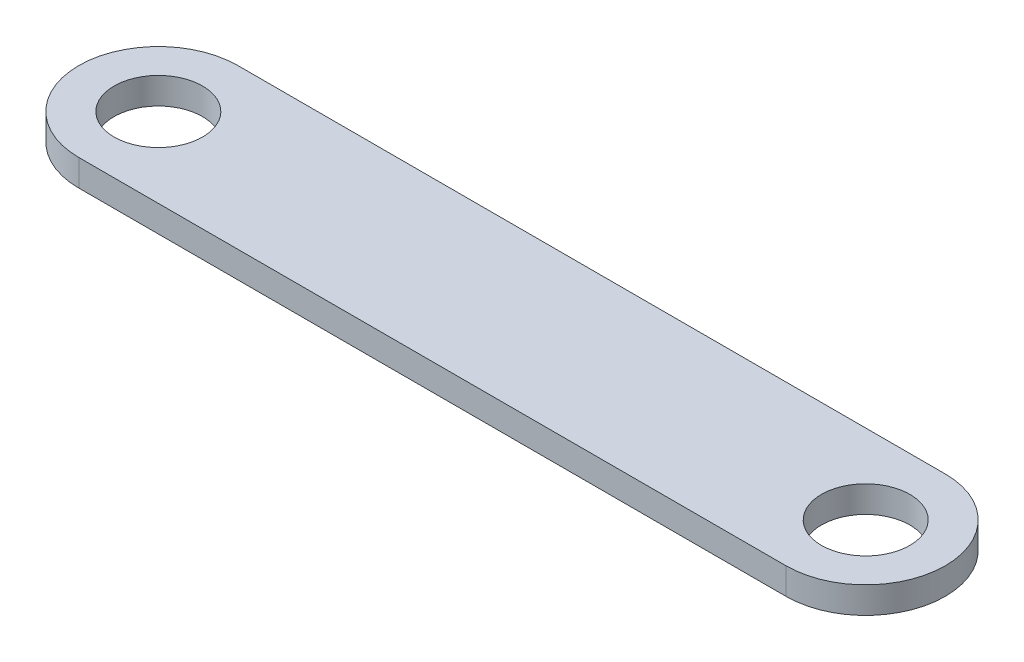
ISO-10303-21;
HEADER;
FILE_DESCRIPTION(('STEP AP214'),'2;1');
FILE_NAME('part.step','',(''),(''),'','','');
FILE_SCHEMA(('AUTOMOTIVE_DESIGN { 1 0 10303 214 1 1 1 1 }'));
ENDSEC;
DATA;
#1=APPLICATION_CONTEXT('core data for automotive mechanical design processes');
#2=APPLICATION_PROTOCOL_DEFINITION('international standard','automotive_design',2000,#1);
#3=PRODUCT_CONTEXT('',#1,'mechanical');
#4=PRODUCT('Part','Part','',(#3));
#5=PRODUCT_RELATED_PRODUCT_CATEGORY('part','',(#4));
#6=PRODUCT_DEFINITION_FORMATION('','',#4);
#7=PRODUCT_DEFINITION_CONTEXT('part definition',#1,'design');
#8=PRODUCT_DEFINITION('design','',#6,#7);
#9=PRODUCT_DEFINITION_SHAPE('','',#8);
#10=(LENGTH_UNIT() NAMED_UNIT(*) SI_UNIT(.MILLI.,.METRE.));
#11=(NAMED_UNIT(*) PLANE_ANGLE_UNIT() SI_UNIT($,.RADIAN.));
#12=(NAMED_UNIT(*) SI_UNIT($,.STERADIAN.) SOLID_ANGLE_UNIT());
#13=UNCERTAINTY_MEASURE_WITH_UNIT(LENGTH_MEASURE(1.E-05),#10,'distance_accuracy_value','');
#14=(GEOMETRIC_REPRESENTATION_CONTEXT(3) GLOBAL_UNCERTAINTY_ASSIGNED_CONTEXT((#13)) GLOBAL_UNIT_ASSIGNED_CONTEXT((#10,
#11,#12)) REPRESENTATION_CONTEXT('',''));
#15=CARTESIAN_POINT('',(0.,0.,0.));
#16=DIRECTION('',(0.,0.,1.));
#17=DIRECTION('',(1.,0.,0.));
#18=AXIS2_PLACEMENT_3D('',#15,#16,#17);
#19=CARTESIAN_POINT('',(0.,1.5,0.));
#20=DIRECTION('',(0.,1.,0.));
#21=DIRECTION('',(0.,0.,1.));
#22=AXIS2_PLACEMENT_3D('',#19,#20,#21);
#23=PLANE('',#22);
#24=CARTESIAN_POINT('',(0.,1.5,0.));
#25=DIRECTION('',(0.,1.,0.));
#26=DIRECTION('',(0.,0.,1.));
#27=AXIS2_PLACEMENT_3D('',#24,#25,#26);
#28=CIRCLE('',#27,5.);
#29=CARTESIAN_POINT('',(0.,1.5,5.));
#30=VERTEX_POINT('',#29);
#31=EDGE_CURVE('E118',#30,#30,#28,.T.);
#32=ORIENTED_EDGE('',*,*,#31,.F.);
#33=EDGE_LOOP('',(#32));
#34=FACE_BOUND('',#33,.T.);
#35=CARTESIAN_POINT('',(0.,1.5,0.));
#36=DIRECTION('',(0.,1.,0.));
#37=DIRECTION('',(0.,0.,1.));
#38=AXIS2_PLACEMENT_3D('',#35,#36,#37);
#39=CIRCLE('',#38,9.);
#40=CARTESIAN_POINT('',(0.,1.5,-9.));
#41=VERTEX_POINT('',#40);
#42=CARTESIAN_POINT('',(0.,1.5,9.));
#43=VERTEX_POINT('',#42);
#44=EDGE_CURVE('E98',#41,#43,#39,.T.);
#45=ORIENTED_EDGE('',*,*,#44,.T.);
#46=DIRECTION('',(1.,0.,0.));
#47=VECTOR('',#46,1.);
#48=CARTESIAN_POINT('',(0.,1.5,9.));
#49=LINE('',#48,#47);
#50=CARTESIAN_POINT('',(80.,1.5,9.));
#51=VERTEX_POINT('',#50);
#52=EDGE_CURVE('E93',#43,#51,#49,.T.);
#53=ORIENTED_EDGE('',*,*,#52,.T.);
#54=CARTESIAN_POINT('',(80.,1.5,0.));
#55=DIRECTION('',(0.,1.,0.));
#56=DIRECTION('',(0.,0.,1.));
#57=AXIS2_PLACEMENT_3D('',#54,#55,#56);
#58=CIRCLE('',#57,9.);
#59=CARTESIAN_POINT('',(80.,1.5,-9.));
#60=VERTEX_POINT('',#59);
#61=EDGE_CURVE('E96',#51,#60,#58,.T.);
#62=ORIENTED_EDGE('',*,*,#61,.T.);
#63=DIRECTION('',(-1.,0.,0.));
#64=VECTOR('',#63,1.);
#65=CARTESIAN_POINT('',(0.,1.5,-9.));
#66=LINE('',#65,#64);
#67=EDGE_CURVE('E63',#60,#41,#66,.T.);
#68=ORIENTED_EDGE('',*,*,#67,.T.);
#69=EDGE_LOOP('',(#45,#53,#62,#68));
#70=FACE_BOUND('',#69,.T.);
#71=CARTESIAN_POINT('',(80.,1.5,0.));
#72=DIRECTION('',(0.,1.,0.));
#73=DIRECTION('',(0.,0.,1.));
#74=AXIS2_PLACEMENT_3D('',#71,#72,#73);
#75=CIRCLE('',#74,5.);
#76=CARTESIAN_POINT('',(80.,1.5,5.));
#77=VERTEX_POINT('',#76);
#78=EDGE_CURVE('E140',#77,#77,#75,.T.);
#79=ORIENTED_EDGE('',*,*,#78,.F.);
#80=EDGE_LOOP('',(#79));
#81=FACE_BOUND('',#80,.T.);
#82=ADVANCED_FACE('F45',(#34,#70,#81),#23,.T.);
#83=CARTESIAN_POINT('',(0.,-1.5,0.));
#84=DIRECTION('',(0.,1.,0.));
#85=DIRECTION('',(0.,0.,1.));
#86=AXIS2_PLACEMENT_3D('',#83,#84,#85);
#87=PLANE('',#86);
#88=CARTESIAN_POINT('',(0.,-1.5,0.));
#89=DIRECTION('',(0.,1.,0.));
#90=DIRECTION('',(0.,0.,1.));
#91=AXIS2_PLACEMENT_3D('',#88,#89,#90);
#92=CIRCLE('',#91,9.);
#93=CARTESIAN_POINT('',(0.,-1.5,-9.));
#94=VERTEX_POINT('',#93);
#95=CARTESIAN_POINT('',(0.,-1.5,9.));
#96=VERTEX_POINT('',#95);
#97=EDGE_CURVE('E114',#94,#96,#92,.T.);
#98=ORIENTED_EDGE('',*,*,#97,.F.);
#99=DIRECTION('',(-1.,0.,0.));
#100=VECTOR('',#99,1.);
#101=CARTESIAN_POINT('',(0.,-1.5,-9.));
#102=LINE('',#101,#100);
#103=CARTESIAN_POINT('',(80.,-1.5,-9.));
#104=VERTEX_POINT('',#103);
#105=EDGE_CURVE('E86',#104,#94,#102,.T.);
#106=ORIENTED_EDGE('',*,*,#105,.F.);
#107=CARTESIAN_POINT('',(80.,-1.5,0.));
#108=DIRECTION('',(0.,1.,0.));
#109=DIRECTION('',(0.,0.,1.));
#110=AXIS2_PLACEMENT_3D('',#107,#108,#109);
#111=CIRCLE('',#110,9.);
#112=CARTESIAN_POINT('',(80.,-1.5,9.));
#113=VERTEX_POINT('',#112);
#114=EDGE_CURVE('E80',#113,#104,#111,.T.);
#115=ORIENTED_EDGE('',*,*,#114,.F.);
#116=DIRECTION('',(1.,0.,0.));
#117=VECTOR('',#116,1.);
#118=CARTESIAN_POINT('',(0.,-1.5,9.));
#119=LINE('',#118,#117);
#120=EDGE_CURVE('E103',#96,#113,#119,.T.);
#121=ORIENTED_EDGE('',*,*,#120,.F.);
#122=EDGE_LOOP('',(#98,#106,#115,#121));
#123=FACE_BOUND('',#122,.T.);
#124=CARTESIAN_POINT('',(0.,-1.5,0.));
#125=DIRECTION('',(0.,1.,0.));
#126=DIRECTION('',(0.,0.,1.));
#127=AXIS2_PLACEMENT_3D('',#124,#125,#126);
#128=CIRCLE('',#127,5.);
#129=CARTESIAN_POINT('',(0.,-1.5,5.));
#130=VERTEX_POINT('',#129);
#131=EDGE_CURVE('E136',#130,#130,#128,.T.);
#132=ORIENTED_EDGE('',*,*,#131,.T.);
#133=EDGE_LOOP('',(#132));
#134=FACE_BOUND('',#133,.T.);
#135=CARTESIAN_POINT('',(80.,-1.5,0.));
#136=DIRECTION('',(0.,1.,0.));
#137=DIRECTION('',(0.,0.,1.));
#138=AXIS2_PLACEMENT_3D('',#135,#136,#137);
#139=CIRCLE('',#138,5.);
#140=CARTESIAN_POINT('',(80.,-1.5,5.));
#141=VERTEX_POINT('',#140);
#142=EDGE_CURVE('E144',#141,#141,#139,.T.);
#143=ORIENTED_EDGE('',*,*,#142,.T.);
#144=EDGE_LOOP('',(#143));
#145=FACE_BOUND('',#144,.T.);
#146=ADVANCED_FACE('F131',(#123,#134,#145),#87,.F.);
#147=CARTESIAN_POINT('',(0.,1.5,0.));
#148=DIRECTION('',(0.,-1.,0.));
#149=DIRECTION('',(0.,0.,-1.));
#150=AXIS2_PLACEMENT_3D('',#147,#148,#149);
#151=CYLINDRICAL_SURFACE('',#150,9.);
#152=ORIENTED_EDGE('',*,*,#97,.T.);
#153=DIRECTION('',(0.,-1.,0.));
#154=VECTOR('',#153,1.);
#155=CARTESIAN_POINT('',(0.,1.5,9.));
#156=LINE('',#155,#154);
#157=EDGE_CURVE('E11',#43,#96,#156,.T.);
#158=ORIENTED_EDGE('',*,*,#157,.F.);
#159=ORIENTED_EDGE('',*,*,#44,.F.);
#160=DIRECTION('',(0.,-1.,0.));
#161=VECTOR('',#160,1.);
#162=CARTESIAN_POINT('',(0.,1.5,-9.));
#163=LINE('',#162,#161);
#164=EDGE_CURVE('E110',#41,#94,#163,.T.);
#165=ORIENTED_EDGE('',*,*,#164,.T.);
#166=EDGE_LOOP('',(#152,#158,#159,#165));
#167=FACE_BOUND('',#166,.T.);
#168=ADVANCED_FACE('F47',(#167),#151,.T.);
#169=CARTESIAN_POINT('',(0.,1.5,9.));
#170=DIRECTION('',(0.,0.,-1.));
#171=DIRECTION('',(-1.,0.,0.));
#172=AXIS2_PLACEMENT_3D('',#169,#170,#171);
#173=PLANE('',#172);
#174=ORIENTED_EDGE('',*,*,#120,.T.);
#175=DIRECTION('',(0.,-1.,0.));
#176=VECTOR('',#175,1.);
#177=CARTESIAN_POINT('',(80.,1.5,9.));
#178=LINE('',#177,#176);
#179=EDGE_CURVE('E55',#51,#113,#178,.T.);
#180=ORIENTED_EDGE('',*,*,#179,.F.);
#181=ORIENTED_EDGE('',*,*,#52,.F.);
#182=ORIENTED_EDGE('',*,*,#157,.T.);
#183=EDGE_LOOP('',(#174,#180,#181,#182));
#184=FACE_BOUND('',#183,.T.);
#185=ADVANCED_FACE('F102',(#184),#173,.F.);
#186=CARTESIAN_POINT('',(80.,1.5,0.));
#187=DIRECTION('',(0.,-1.,0.));
#188=DIRECTION('',(0.,0.,-1.));
#189=AXIS2_PLACEMENT_3D('',#186,#187,#188);
#190=CYLINDRICAL_SURFACE('',#189,9.);
#191=ORIENTED_EDGE('',*,*,#114,.T.);
#192=DIRECTION('',(0.,-1.,0.));
#193=VECTOR('',#192,1.);
#194=CARTESIAN_POINT('',(80.,1.5,-9.));
#195=LINE('',#194,#193);
#196=EDGE_CURVE('E105',#60,#104,#195,.T.);
#197=ORIENTED_EDGE('',*,*,#196,.F.);
#198=ORIENTED_EDGE('',*,*,#61,.F.);
#199=ORIENTED_EDGE('',*,*,#179,.T.);
#200=EDGE_LOOP('',(#191,#197,#198,#199));
#201=FACE_BOUND('',#200,.T.);
#202=ADVANCED_FACE('F106',(#201),#190,.T.);
#203=CARTESIAN_POINT('',(0.,1.5,-9.));
#204=DIRECTION('',(0.,0.,1.));
#205=DIRECTION('',(1.,0.,0.));
#206=AXIS2_PLACEMENT_3D('',#203,#204,#205);
#207=PLANE('',#206);
#208=ORIENTED_EDGE('',*,*,#105,.T.);
#209=ORIENTED_EDGE('',*,*,#164,.F.);
#210=ORIENTED_EDGE('',*,*,#67,.F.);
#211=ORIENTED_EDGE('',*,*,#196,.T.);
#212=EDGE_LOOP('',(#208,#209,#210,#211));
#213=FACE_BOUND('',#212,.T.);
#214=ADVANCED_FACE('F128',(#213),#207,.F.);
#215=CARTESIAN_POINT('',(0.,1.5,0.));
#216=DIRECTION('',(0.,-1.,0.));
#217=DIRECTION('',(0.,0.,-1.));
#218=AXIS2_PLACEMENT_3D('',#215,#216,#217);
#219=CYLINDRICAL_SURFACE('',#218,5.);
#220=ORIENTED_EDGE('',*,*,#31,.T.);
#221=EDGE_LOOP('',(#220));
#222=FACE_BOUND('',#221,.T.);
#223=ORIENTED_EDGE('',*,*,#131,.F.);
#224=EDGE_LOOP('',(#223));
#225=FACE_BOUND('',#224,.T.);
#226=ADVANCED_FACE('F163',(#222,#225),#219,.F.);
#227=CARTESIAN_POINT('',(80.,1.5,0.));
#228=DIRECTION('',(0.,-1.,0.));
#229=DIRECTION('',(0.,0.,-1.));
#230=AXIS2_PLACEMENT_3D('',#227,#228,#229);
#231=CYLINDRICAL_SURFACE('',#230,5.);
#232=ORIENTED_EDGE('',*,*,#78,.T.);
#233=EDGE_LOOP('',(#232));
#234=FACE_BOUND('',#233,.T.);
#235=ORIENTED_EDGE('',*,*,#142,.F.);
#236=EDGE_LOOP('',(#235));
#237=FACE_BOUND('',#236,.T.);
#238=ADVANCED_FACE('F152',(#234,#237),#231,.F.);
#239=CLOSED_SHELL('',(#82,#146,#168,#185,#202,#214,#226,#238));
#240=MANIFOLD_SOLID_BREP('B2',#239);
#241=ADVANCED_BREP_SHAPE_REPRESENTATION('',(#18,#240),#14);
#242=SHAPE_DEFINITION_REPRESENTATION(#9,#241);
ENDSEC;
END-ISO-10303-21;
